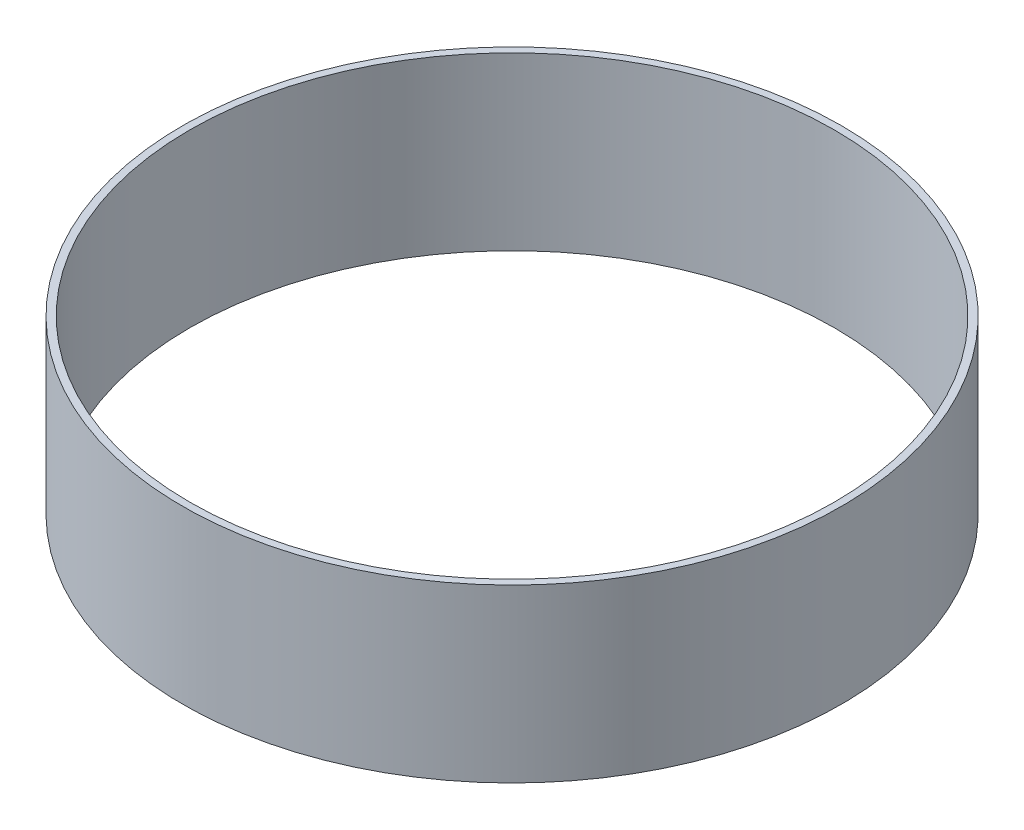
ISO-10303-21;
HEADER;
FILE_DESCRIPTION(('STEP AP214'),'2;1');
FILE_NAME('part.step','',(''),(''),'','','');
FILE_SCHEMA(('AUTOMOTIVE_DESIGN { 1 0 10303 214 1 1 1 1 }'));
ENDSEC;
DATA;
#1=APPLICATION_CONTEXT('core data for automotive mechanical design processes');
#2=APPLICATION_PROTOCOL_DEFINITION('international standard','automotive_design',2000,#1);
#3=PRODUCT_CONTEXT('',#1,'mechanical');
#4=PRODUCT('Part','Part','',(#3));
#5=PRODUCT_RELATED_PRODUCT_CATEGORY('part','',(#4));
#6=PRODUCT_DEFINITION_FORMATION('','',#4);
#7=PRODUCT_DEFINITION_CONTEXT('part definition',#1,'design');
#8=PRODUCT_DEFINITION('design','',#6,#7);
#9=PRODUCT_DEFINITION_SHAPE('','',#8);
#10=(LENGTH_UNIT() NAMED_UNIT(*) SI_UNIT(.MILLI.,.METRE.));
#11=(NAMED_UNIT(*) PLANE_ANGLE_UNIT() SI_UNIT($,.RADIAN.));
#12=(NAMED_UNIT(*) SI_UNIT($,.STERADIAN.) SOLID_ANGLE_UNIT());
#13=UNCERTAINTY_MEASURE_WITH_UNIT(LENGTH_MEASURE(1.E-05),#10,'distance_accuracy_value','');
#14=(GEOMETRIC_REPRESENTATION_CONTEXT(3) GLOBAL_UNCERTAINTY_ASSIGNED_CONTEXT((#13)) GLOBAL_UNIT_ASSIGNED_CONTEXT((#10,
#11,#12)) REPRESENTATION_CONTEXT('',''));
#15=CARTESIAN_POINT('',(0.,0.,0.));
#16=DIRECTION('',(0.,0.,1.));
#17=DIRECTION('',(1.,0.,0.));
#18=AXIS2_PLACEMENT_3D('',#15,#16,#17);
#19=CARTESIAN_POINT('',(-51.4375515041831,229.372258045113,94.6729830182891));
#20=DIRECTION('',(0.,-1.,0.));
#21=DIRECTION('',(0.,0.,1.));
#22=AXIS2_PLACEMENT_3D('',#19,#20,#21);
#23=CYLINDRICAL_SURFACE('',#22,68.4999999999998);
#24=CARTESIAN_POINT('',(-51.4375515041831,0.,94.6729830182891));
#25=DIRECTION('',(0.,-1.,0.));
#26=DIRECTION('',(0.,0.,-1.));
#27=AXIS2_PLACEMENT_3D('',#24,#25,#26);
#28=CIRCLE('',#27,68.4999999999998);
#29=CARTESIAN_POINT('',(-51.4375515041831,0.,26.1729830182893));
#30=VERTEX_POINT('',#29);
#31=EDGE_CURVE('E46',#30,#30,#28,.T.);
#32=ORIENTED_EDGE('',*,*,#31,.F.);
#33=EDGE_LOOP('',(#32));
#34=FACE_BOUND('',#33,.T.);
#35=CARTESIAN_POINT('',(-51.4375515041831,35.6249999999999,94.6729830182891));
#36=DIRECTION('',(0.,-1.,0.));
#37=DIRECTION('',(0.,0.,-1.));
#38=AXIS2_PLACEMENT_3D('',#35,#36,#37);
#39=CIRCLE('',#38,68.4999999999998);
#40=CARTESIAN_POINT('',(-51.4375515041831,35.6249999999999,26.1729830182893));
#41=VERTEX_POINT('',#40);
#42=EDGE_CURVE('E10',#41,#41,#39,.T.);
#43=ORIENTED_EDGE('',*,*,#42,.T.);
#44=EDGE_LOOP('',(#43));
#45=FACE_BOUND('',#44,.T.);
#46=ADVANCED_FACE('F39',(#34,#45),#23,.T.);
#47=CARTESIAN_POINT('',(-51.4375515041831,0.,94.6729830182891));
#48=DIRECTION('',(0.,1.,0.));
#49=DIRECTION('',(0.,0.,-1.));
#50=AXIS2_PLACEMENT_3D('',#47,#48,#49);
#51=PLANE('',#50);
#52=ORIENTED_EDGE('',*,*,#31,.T.);
#53=EDGE_LOOP('',(#52));
#54=FACE_BOUND('',#53,.T.);
#55=CARTESIAN_POINT('',(-51.4375515041831,0.,94.6729830182891));
#56=DIRECTION('',(0.,-1.,0.));
#57=DIRECTION('',(0.,0.,-1.));
#58=AXIS2_PLACEMENT_3D('',#55,#56,#57);
#59=CIRCLE('',#58,66.9999999999998);
#60=CARTESIAN_POINT('',(-51.4375515041831,0.,27.6729830182893));
#61=VERTEX_POINT('',#60);
#62=EDGE_CURVE('E51',#61,#61,#59,.T.);
#63=ORIENTED_EDGE('',*,*,#62,.F.);
#64=EDGE_LOOP('',(#63));
#65=FACE_BOUND('',#64,.T.);
#66=ADVANCED_FACE('F64',(#54,#65),#51,.F.);
#67=CARTESIAN_POINT('',(-51.4375515041831,229.372258045113,94.6729830182891));
#68=DIRECTION('',(0.,-1.,0.));
#69=DIRECTION('',(0.,0.,1.));
#70=AXIS2_PLACEMENT_3D('',#67,#68,#69);
#71=CYLINDRICAL_SURFACE('',#70,66.9999999999998);
#72=ORIENTED_EDGE('',*,*,#62,.T.);
#73=EDGE_LOOP('',(#72));
#74=FACE_BOUND('',#73,.T.);
#75=CARTESIAN_POINT('',(-51.4375515041831,35.6249999999999,94.6729830182891));
#76=DIRECTION('',(0.,-1.,0.));
#77=DIRECTION('',(0.,0.,-1.));
#78=AXIS2_PLACEMENT_3D('',#75,#76,#77);
#79=CIRCLE('',#78,66.9999999999998);
#80=CARTESIAN_POINT('',(-51.4375515041831,35.6249999999999,27.6729830182893));
#81=VERTEX_POINT('',#80);
#82=EDGE_CURVE('E42',#81,#81,#79,.T.);
#83=ORIENTED_EDGE('',*,*,#82,.F.);
#84=EDGE_LOOP('',(#83));
#85=FACE_BOUND('',#84,.T.);
#86=ADVANCED_FACE('F62',(#74,#85),#71,.F.);
#87=CARTESIAN_POINT('',(-51.4375515041836,35.6249999999999,94.6729830182891));
#88=DIRECTION('',(0.,1.,0.));
#89=DIRECTION('',(-0.118023640640617,0.,0.993010785565763));
#90=AXIS2_PLACEMENT_3D('',#87,#88,#89);
#91=PLANE('',#90);
#92=ORIENTED_EDGE('',*,*,#82,.T.);
#93=EDGE_LOOP('',(#92));
#94=FACE_BOUND('',#93,.T.);
#95=ORIENTED_EDGE('',*,*,#42,.F.);
#96=EDGE_LOOP('',(#95));
#97=FACE_BOUND('',#96,.T.);
#98=ADVANCED_FACE('F59',(#94,#97),#91,.T.);
#99=CLOSED_SHELL('',(#46,#66,#86,#98));
#100=MANIFOLD_SOLID_BREP('B2',#99);
#101=ADVANCED_BREP_SHAPE_REPRESENTATION('',(#18,#100),#14);
#102=SHAPE_DEFINITION_REPRESENTATION(#9,#101);
ENDSEC;
END-ISO-10303-21;
